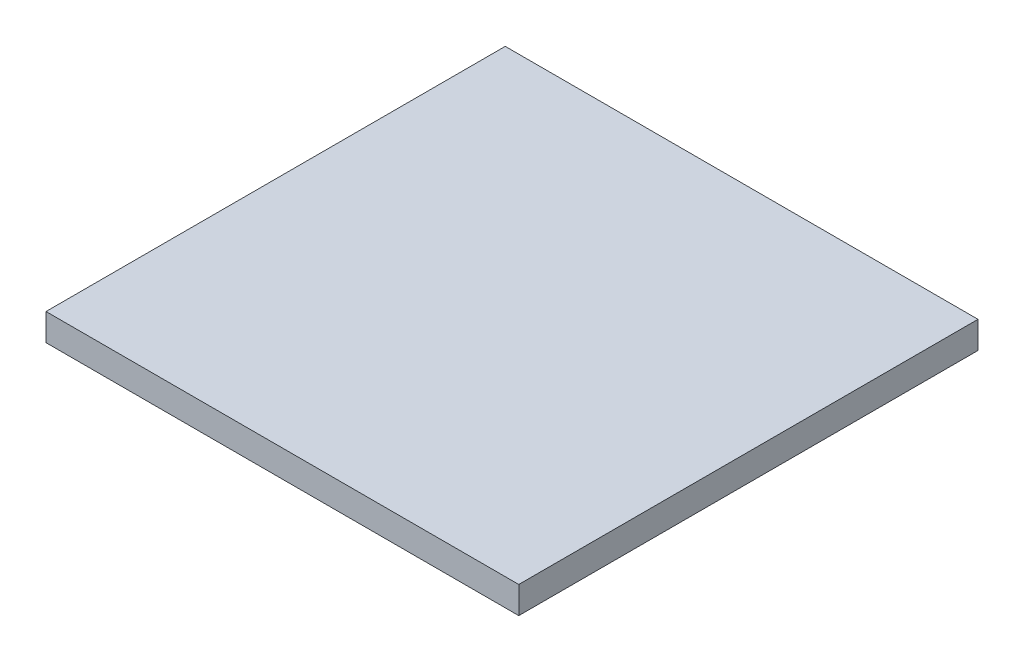
ISO-10303-21;
HEADER;
FILE_DESCRIPTION(('STEP AP214'),'2;1');
FILE_NAME('part.step','',(''),(''),'','','');
FILE_SCHEMA(('AUTOMOTIVE_DESIGN { 1 0 10303 214 1 1 1 1 }'));
ENDSEC;
DATA;
#1=APPLICATION_CONTEXT('core data for automotive mechanical design processes');
#2=APPLICATION_PROTOCOL_DEFINITION('international standard','automotive_design',2000,#1);
#3=PRODUCT_CONTEXT('',#1,'mechanical');
#4=PRODUCT('Part','Part','',(#3));
#5=PRODUCT_RELATED_PRODUCT_CATEGORY('part','',(#4));
#6=PRODUCT_DEFINITION_FORMATION('','',#4);
#7=PRODUCT_DEFINITION_CONTEXT('part definition',#1,'design');
#8=PRODUCT_DEFINITION('design','',#6,#7);
#9=PRODUCT_DEFINITION_SHAPE('','',#8);
#10=(LENGTH_UNIT() NAMED_UNIT(*) SI_UNIT(.MILLI.,.METRE.));
#11=(NAMED_UNIT(*) PLANE_ANGLE_UNIT() SI_UNIT($,.RADIAN.));
#12=(NAMED_UNIT(*) SI_UNIT($,.STERADIAN.) SOLID_ANGLE_UNIT());
#13=UNCERTAINTY_MEASURE_WITH_UNIT(LENGTH_MEASURE(1.E-05),#10,'distance_accuracy_value','');
#14=(GEOMETRIC_REPRESENTATION_CONTEXT(3) GLOBAL_UNCERTAINTY_ASSIGNED_CONTEXT((#13)) GLOBAL_UNIT_ASSIGNED_CONTEXT((#10,
#11,#12)) REPRESENTATION_CONTEXT('',''));
#15=CARTESIAN_POINT('',(0.,0.,0.));
#16=DIRECTION('',(0.,0.,1.));
#17=DIRECTION('',(1.,0.,0.));
#18=AXIS2_PLACEMENT_3D('',#15,#16,#17);
#19=CARTESIAN_POINT('',(0.,0.,68.));
#20=DIRECTION('',(1.,0.,0.));
#21=DIRECTION('',(0.,0.,-1.));
#22=AXIS2_PLACEMENT_3D('',#19,#20,#21);
#23=PLANE('',#22);
#24=DIRECTION('',(0.,-1.,0.));
#25=VECTOR('',#24,1.);
#26=CARTESIAN_POINT('',(0.,0.,0.));
#27=LINE('',#26,#25);
#28=CARTESIAN_POINT('',(0.,4.,0.));
#29=VERTEX_POINT('',#28);
#30=CARTESIAN_POINT('',(0.,0.,0.));
#31=VERTEX_POINT('',#30);
#32=EDGE_CURVE('E108',#29,#31,#27,.T.);
#33=ORIENTED_EDGE('',*,*,#32,.T.);
#34=DIRECTION('',(0.,0.,-1.));
#35=VECTOR('',#34,1.);
#36=CARTESIAN_POINT('',(0.,0.,68.));
#37=LINE('',#36,#35);
#38=CARTESIAN_POINT('',(0.,0.,68.));
#39=VERTEX_POINT('',#38);
#40=EDGE_CURVE('E11',#39,#31,#37,.T.);
#41=ORIENTED_EDGE('',*,*,#40,.F.);
#42=DIRECTION('',(0.,-1.,0.));
#43=VECTOR('',#42,1.);
#44=CARTESIAN_POINT('',(0.,0.,68.));
#45=LINE('',#44,#43);
#46=CARTESIAN_POINT('',(0.,4.,68.));
#47=VERTEX_POINT('',#46);
#48=EDGE_CURVE('E92',#47,#39,#45,.T.);
#49=ORIENTED_EDGE('',*,*,#48,.F.);
#50=DIRECTION('',(0.,0.,-1.));
#51=VECTOR('',#50,1.);
#52=CARTESIAN_POINT('',(0.,4.,68.));
#53=LINE('',#52,#51);
#54=EDGE_CURVE('E105',#47,#29,#53,.T.);
#55=ORIENTED_EDGE('',*,*,#54,.T.);
#56=EDGE_LOOP('',(#33,#41,#49,#55));
#57=FACE_BOUND('',#56,.T.);
#58=ADVANCED_FACE('F43',(#57),#23,.F.);
#59=CARTESIAN_POINT('',(0.,0.,68.));
#60=DIRECTION('',(0.,1.,0.));
#61=DIRECTION('',(0.,0.,1.));
#62=AXIS2_PLACEMENT_3D('',#59,#60,#61);
#63=PLANE('',#62);
#64=DIRECTION('',(1.,0.,0.));
#65=VECTOR('',#64,1.);
#66=CARTESIAN_POINT('',(0.,0.,0.));
#67=LINE('',#66,#65);
#68=CARTESIAN_POINT('',(70.,0.,0.));
#69=VERTEX_POINT('',#68);
#70=EDGE_CURVE('E97',#31,#69,#67,.T.);
#71=ORIENTED_EDGE('',*,*,#70,.T.);
#72=DIRECTION('',(0.,0.,-1.));
#73=VECTOR('',#72,1.);
#74=CARTESIAN_POINT('',(70.,0.,68.));
#75=LINE('',#74,#73);
#76=CARTESIAN_POINT('',(70.,0.,68.));
#77=VERTEX_POINT('',#76);
#78=EDGE_CURVE('E51',#77,#69,#75,.T.);
#79=ORIENTED_EDGE('',*,*,#78,.F.);
#80=DIRECTION('',(1.,0.,0.));
#81=VECTOR('',#80,1.);
#82=CARTESIAN_POINT('',(0.,0.,68.));
#83=LINE('',#82,#81);
#84=EDGE_CURVE('E87',#39,#77,#83,.T.);
#85=ORIENTED_EDGE('',*,*,#84,.F.);
#86=ORIENTED_EDGE('',*,*,#40,.T.);
#87=EDGE_LOOP('',(#71,#79,#85,#86));
#88=FACE_BOUND('',#87,.T.);
#89=ADVANCED_FACE('F100',(#88),#63,.F.);
#90=CARTESIAN_POINT('',(70.,0.,68.));
#91=DIRECTION('',(-1.,0.,0.));
#92=DIRECTION('',(0.,0.,1.));
#93=AXIS2_PLACEMENT_3D('',#90,#91,#92);
#94=PLANE('',#93);
#95=DIRECTION('',(0.,1.,0.));
#96=VECTOR('',#95,1.);
#97=CARTESIAN_POINT('',(70.,0.,0.));
#98=LINE('',#97,#96);
#99=CARTESIAN_POINT('',(70.,4.,0.));
#100=VERTEX_POINT('',#99);
#101=EDGE_CURVE('E78',#69,#100,#98,.T.);
#102=ORIENTED_EDGE('',*,*,#101,.T.);
#103=DIRECTION('',(0.,0.,-1.));
#104=VECTOR('',#103,1.);
#105=CARTESIAN_POINT('',(70.,4.,68.));
#106=LINE('',#105,#104);
#107=CARTESIAN_POINT('',(70.,4.,68.));
#108=VERTEX_POINT('',#107);
#109=EDGE_CURVE('E98',#108,#100,#106,.T.);
#110=ORIENTED_EDGE('',*,*,#109,.F.);
#111=DIRECTION('',(0.,1.,0.));
#112=VECTOR('',#111,1.);
#113=CARTESIAN_POINT('',(70.,0.,68.));
#114=LINE('',#113,#112);
#115=EDGE_CURVE('E95',#77,#108,#114,.T.);
#116=ORIENTED_EDGE('',*,*,#115,.F.);
#117=ORIENTED_EDGE('',*,*,#78,.T.);
#118=EDGE_LOOP('',(#102,#110,#116,#117));
#119=FACE_BOUND('',#118,.T.);
#120=ADVANCED_FACE('F99',(#119),#94,.F.);
#121=CARTESIAN_POINT('',(0.,4.,68.));
#122=DIRECTION('',(0.,-1.,0.));
#123=DIRECTION('',(0.,0.,-1.));
#124=AXIS2_PLACEMENT_3D('',#121,#122,#123);
#125=PLANE('',#124);
#126=DIRECTION('',(-1.,0.,0.));
#127=VECTOR('',#126,1.);
#128=CARTESIAN_POINT('',(0.,4.,0.));
#129=LINE('',#128,#127);
#130=EDGE_CURVE('E85',#100,#29,#129,.T.);
#131=ORIENTED_EDGE('',*,*,#130,.T.);
#132=ORIENTED_EDGE('',*,*,#54,.F.);
#133=DIRECTION('',(-1.,0.,0.));
#134=VECTOR('',#133,1.);
#135=CARTESIAN_POINT('',(0.,4.,68.));
#136=LINE('',#135,#134);
#137=EDGE_CURVE('E56',#108,#47,#136,.T.);
#138=ORIENTED_EDGE('',*,*,#137,.F.);
#139=ORIENTED_EDGE('',*,*,#109,.T.);
#140=EDGE_LOOP('',(#131,#132,#138,#139));
#141=FACE_BOUND('',#140,.T.);
#142=ADVANCED_FACE('F111',(#141),#125,.F.);
#143=CARTESIAN_POINT('',(0.,0.,68.));
#144=DIRECTION('',(0.,0.,-1.));
#145=DIRECTION('',(-1.,0.,0.));
#146=AXIS2_PLACEMENT_3D('',#143,#144,#145);
#147=PLANE('',#146);
#148=ORIENTED_EDGE('',*,*,#48,.T.);
#149=ORIENTED_EDGE('',*,*,#84,.T.);
#150=ORIENTED_EDGE('',*,*,#115,.T.);
#151=ORIENTED_EDGE('',*,*,#137,.T.);
#152=EDGE_LOOP('',(#148,#149,#150,#151));
#153=FACE_BOUND('',#152,.T.);
#154=ADVANCED_FACE('F89',(#153),#147,.F.);
#155=CARTESIAN_POINT('',(0.,0.,0.));
#156=DIRECTION('',(0.,0.,-1.));
#157=DIRECTION('',(-1.,0.,0.));
#158=AXIS2_PLACEMENT_3D('',#155,#156,#157);
#159=PLANE('',#158);
#160=ORIENTED_EDGE('',*,*,#32,.F.);
#161=ORIENTED_EDGE('',*,*,#130,.F.);
#162=ORIENTED_EDGE('',*,*,#101,.F.);
#163=ORIENTED_EDGE('',*,*,#70,.F.);
#164=EDGE_LOOP('',(#160,#161,#162,#163));
#165=FACE_BOUND('',#164,.T.);
#166=ADVANCED_FACE('F118',(#165),#159,.T.);
#167=CLOSED_SHELL('',(#58,#89,#120,#142,#154,#166));
#168=MANIFOLD_SOLID_BREP('B2',#167);
#169=ADVANCED_BREP_SHAPE_REPRESENTATION('',(#18,#168),#14);
#170=SHAPE_DEFINITION_REPRESENTATION(#9,#169);
ENDSEC;
END-ISO-10303-21;
